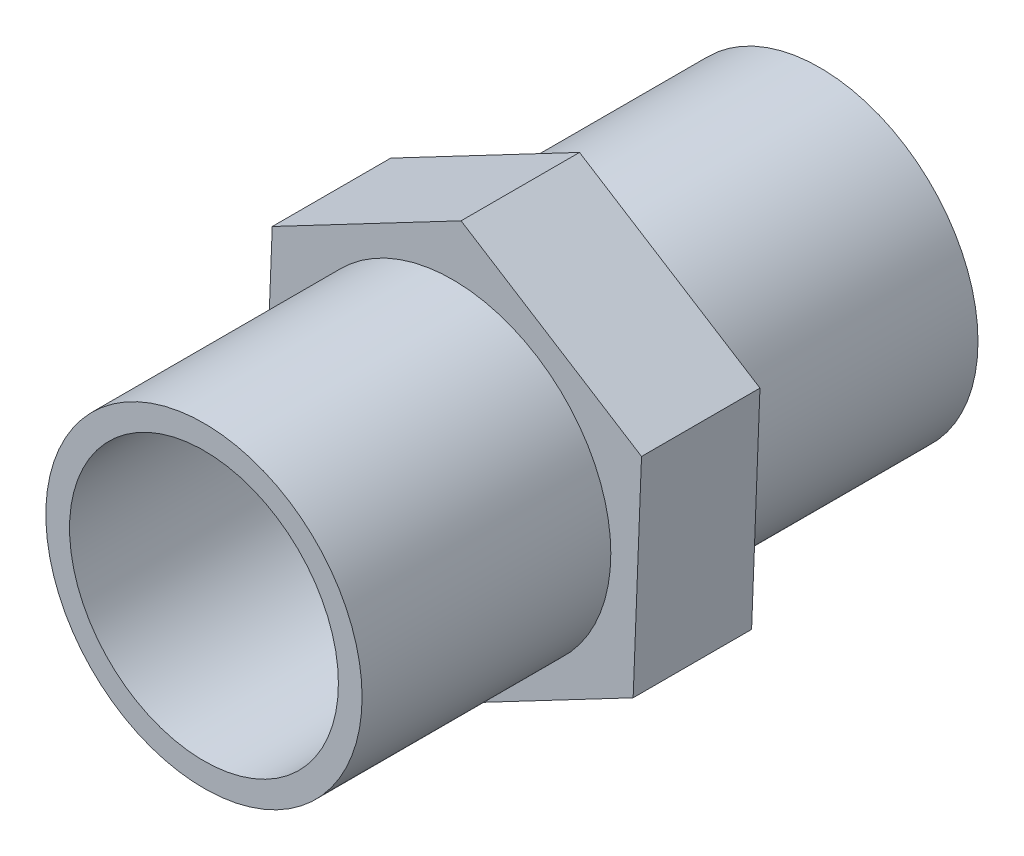
ISO-10303-21;
HEADER;
FILE_DESCRIPTION(('STEP AP214'),'2;1');
FILE_NAME('part.step','',(''),(''),'','','');
FILE_SCHEMA(('AUTOMOTIVE_DESIGN { 1 0 10303 214 1 1 1 1 }'));
ENDSEC;
DATA;
#1=APPLICATION_CONTEXT('core data for automotive mechanical design processes');
#2=APPLICATION_PROTOCOL_DEFINITION('international standard','automotive_design',2000,#1);
#3=PRODUCT_CONTEXT('',#1,'mechanical');
#4=PRODUCT('Part','Part','',(#3));
#5=PRODUCT_RELATED_PRODUCT_CATEGORY('part','',(#4));
#6=PRODUCT_DEFINITION_FORMATION('','',#4);
#7=PRODUCT_DEFINITION_CONTEXT('part definition',#1,'design');
#8=PRODUCT_DEFINITION('design','',#6,#7);
#9=PRODUCT_DEFINITION_SHAPE('','',#8);
#10=(LENGTH_UNIT() NAMED_UNIT(*) SI_UNIT(.MILLI.,.METRE.));
#11=(NAMED_UNIT(*) PLANE_ANGLE_UNIT() SI_UNIT($,.RADIAN.));
#12=(NAMED_UNIT(*) SI_UNIT($,.STERADIAN.) SOLID_ANGLE_UNIT());
#13=UNCERTAINTY_MEASURE_WITH_UNIT(LENGTH_MEASURE(1.E-05),#10,'distance_accuracy_value','');
#14=(GEOMETRIC_REPRESENTATION_CONTEXT(3) GLOBAL_UNCERTAINTY_ASSIGNED_CONTEXT((#13)) GLOBAL_UNIT_ASSIGNED_CONTEXT((#10,
#11,#12)) REPRESENTATION_CONTEXT('',''));
#15=CARTESIAN_POINT('',(0.,0.,0.));
#16=DIRECTION('',(0.,0.,1.));
#17=DIRECTION('',(1.,0.,0.));
#18=AXIS2_PLACEMENT_3D('',#15,#16,#17);
#19=CARTESIAN_POINT('',(-1.77635683940025E-12,-3.33066907387547E-13,26.0000000000002));
#20=DIRECTION('',(0.,0.,1.));
#21=DIRECTION('',(1.,0.,0.));
#22=AXIS2_PLACEMENT_3D('',#19,#20,#21);
#23=PLANE('',#22);
#24=CARTESIAN_POINT('',(-1.77635683940025E-12,-3.33066907387547E-13,26.0000000000002));
#25=DIRECTION('',(0.,0.,1.));
#26=DIRECTION('',(1.,0.,0.));
#27=AXIS2_PLACEMENT_3D('',#24,#25,#26);
#28=CIRCLE('',#27,13.35);
#29=CARTESIAN_POINT('',(13.3499999999982,-3.31387911903236E-13,26.0000000000002));
#30=VERTEX_POINT('',#29);
#31=EDGE_CURVE('E157',#30,#30,#28,.T.);
#32=ORIENTED_EDGE('',*,*,#31,.T.);
#33=EDGE_LOOP('',(#32));
#34=FACE_BOUND('',#33,.T.);
#35=CARTESIAN_POINT('',(-1.77635683940025E-12,-3.33066907387547E-13,26.0000000000002));
#36=DIRECTION('',(0.,0.,1.));
#37=DIRECTION('',(1.,0.,0.));
#38=AXIS2_PLACEMENT_3D('',#35,#36,#37);
#39=CIRCLE('',#38,11.35);
#40=CARTESIAN_POINT('',(11.3499999999982,-3.31639446807253E-13,26.0000000000002));
#41=VERTEX_POINT('',#40);
#42=EDGE_CURVE('E151',#41,#41,#39,.T.);
#43=ORIENTED_EDGE('',*,*,#42,.F.);
#44=EDGE_LOOP('',(#43));
#45=FACE_BOUND('',#44,.T.);
#46=ADVANCED_FACE('F40',(#34,#45),#23,.T.);
#47=CARTESIAN_POINT('',(-1.77635683940025E-12,-3.33066907387547E-13,26.0000000000002));
#48=DIRECTION('',(0.,0.,-1.));
#49=DIRECTION('',(-1.,0.,0.));
#50=AXIS2_PLACEMENT_3D('',#47,#48,#49);
#51=CYLINDRICAL_SURFACE('',#50,13.35);
#52=CARTESIAN_POINT('',(1.77635683940025E-12,1.11022302462516E-13,5.00000000000034));
#53=DIRECTION('',(0.,0.,1.));
#54=DIRECTION('',(1.,0.,0.));
#55=AXIS2_PLACEMENT_3D('',#52,#53,#54);
#56=CIRCLE('',#55,13.35);
#57=CARTESIAN_POINT('',(13.3500000000018,1.12701297946827E-13,5.00000000000034));
#58=VERTEX_POINT('',#57);
#59=EDGE_CURVE('E147',#58,#58,#56,.T.);
#60=ORIENTED_EDGE('',*,*,#59,.T.);
#61=EDGE_LOOP('',(#60));
#62=FACE_BOUND('',#61,.T.);
#63=ORIENTED_EDGE('',*,*,#31,.F.);
#64=EDGE_LOOP('',(#63));
#65=FACE_BOUND('',#64,.T.);
#66=ADVANCED_FACE('F42',(#62,#65),#51,.T.);
#67=CARTESIAN_POINT('',(-1.77635683940025E-12,-3.33066907387547E-13,26.0000000000002));
#68=DIRECTION('',(0.,0.,-1.));
#69=DIRECTION('',(-1.,0.,0.));
#70=AXIS2_PLACEMENT_3D('',#67,#68,#69);
#71=CYLINDRICAL_SURFACE('',#70,11.35);
#72=CARTESIAN_POINT('',(1.77635683940025E-12,1.11022302462516E-13,5.00000000000034));
#73=DIRECTION('',(0.,0.,1.));
#74=DIRECTION('',(1.,0.,0.));
#75=AXIS2_PLACEMENT_3D('',#72,#73,#74);
#76=CIRCLE('',#75,11.35);
#77=CARTESIAN_POINT('',(11.3500000000018,1.1244976304281E-13,5.00000000000034));
#78=VERTEX_POINT('',#77);
#79=EDGE_CURVE('E44',#78,#78,#76,.T.);
#80=ORIENTED_EDGE('',*,*,#79,.F.);
#81=EDGE_LOOP('',(#80));
#82=FACE_BOUND('',#81,.T.);
#83=ORIENTED_EDGE('',*,*,#42,.T.);
#84=EDGE_LOOP('',(#83));
#85=FACE_BOUND('',#84,.T.);
#86=ADVANCED_FACE('F176',(#82,#85),#71,.F.);
#87=CARTESIAN_POINT('',(1.77635683940025E-12,1.11022302462516E-13,5.00000000000034));
#88=DIRECTION('',(0.,0.,1.));
#89=DIRECTION('',(1.,0.,0.));
#90=AXIS2_PLACEMENT_3D('',#87,#88,#89);
#91=PLANE('',#90);
#92=ORIENTED_EDGE('',*,*,#79,.T.);
#93=EDGE_LOOP('',(#92));
#94=FACE_BOUND('',#93,.T.);
#95=ADVANCED_FACE('F216',(#94),#91,.T.);
#96=CARTESIAN_POINT('',(15.2347430276922,-9.61265103578213,4.99999999999989));
#97=DIRECTION('',(-0.99922858635306,0.0392712644928826,0.));
#98=DIRECTION('',(-0.0392712644928829,-0.999228586353058,0.));
#99=AXIS2_PLACEMENT_3D('',#96,#97,#98);
#100=PLANE('',#99);
#101=DIRECTION('',(0.0392712644928829,0.999228586353058,0.));
#102=VECTOR('',#101,1.);
#103=CARTESIAN_POINT('',(15.2347430276896,-9.61265103578191,-5.00000000000034));
#104=LINE('',#103,#102);
#105=CARTESIAN_POINT('',(15.2347430276896,-9.61265103578191,-5.00000000000034));
#106=VERTEX_POINT('',#105);
#107=CARTESIAN_POINT('',(15.9421715085468,8.38734896421744,-5.00000000000012));
#108=VERTEX_POINT('',#107);
#109=EDGE_CURVE('E127',#106,#108,#104,.T.);
#110=ORIENTED_EDGE('',*,*,#109,.T.);
#111=DIRECTION('',(0.,0.,-1.));
#112=VECTOR('',#111,1.);
#113=CARTESIAN_POINT('',(15.9421715085459,8.38734896421744,4.99999999999967));
#114=LINE('',#113,#112);
#115=CARTESIAN_POINT('',(15.9421715085459,8.38734896421744,4.99999999999967));
#116=VERTEX_POINT('',#115);
#117=EDGE_CURVE('E144',#116,#108,#114,.T.);
#118=ORIENTED_EDGE('',*,*,#117,.F.);
#119=DIRECTION('',(0.0392712644928829,0.999228586353058,0.));
#120=VECTOR('',#119,1.);
#121=CARTESIAN_POINT('',(15.2347430276922,-9.61265103578213,4.99999999999989));
#122=LINE('',#121,#120);
#123=CARTESIAN_POINT('',(15.2347430276922,-9.61265103578213,4.99999999999989));
#124=VERTEX_POINT('',#123);
#125=EDGE_CURVE('E137',#124,#116,#122,.T.);
#126=ORIENTED_EDGE('',*,*,#125,.F.);
#127=DIRECTION('',(0.,0.,-1.));
#128=VECTOR('',#127,1.);
#129=CARTESIAN_POINT('',(15.2347430276922,-9.61265103578213,4.99999999999989));
#130=LINE('',#129,#128);
#131=EDGE_CURVE('E123',#124,#106,#130,.T.);
#132=ORIENTED_EDGE('',*,*,#131,.T.);
#133=EDGE_LOOP('',(#110,#118,#126,#132));
#134=FACE_BOUND('',#133,.T.);
#135=ADVANCED_FACE('F207',(#134),#100,.F.);
#136=CARTESIAN_POINT('',(15.9421715085459,8.38734896421744,4.99999999999967));
#137=DIRECTION('',(-0.533624205866104,-0.84572170772292,0.));
#138=DIRECTION('',(0.845721707722921,-0.533624205866103,0.));
#139=AXIS2_PLACEMENT_3D('',#136,#137,#138);
#140=PLANE('',#139);
#141=DIRECTION('',(-0.845721707722921,0.533624205866103,0.));
#142=VECTOR('',#141,1.);
#143=CARTESIAN_POINT('',(15.9421715085468,8.38734896421744,-5.00000000000012));
#144=LINE('',#143,#142);
#145=CARTESIAN_POINT('',(0.707428480855476,17.9999999999997,-5.00000000000034));
#146=VERTEX_POINT('',#145);
#147=EDGE_CURVE('E130',#108,#146,#144,.T.);
#148=ORIENTED_EDGE('',*,*,#147,.T.);
#149=DIRECTION('',(0.,0.,-1.));
#150=VECTOR('',#149,1.);
#151=CARTESIAN_POINT('',(0.707428480854588,17.9999999999998,4.99999999999989));
#152=LINE('',#151,#150);
#153=CARTESIAN_POINT('',(0.707428480854588,17.9999999999998,4.99999999999989));
#154=VERTEX_POINT('',#153);
#155=EDGE_CURVE('E141',#154,#146,#152,.T.);
#156=ORIENTED_EDGE('',*,*,#155,.F.);
#157=DIRECTION('',(-0.845721707722921,0.533624205866103,0.));
#158=VECTOR('',#157,1.);
#159=CARTESIAN_POINT('',(15.9421715085459,8.38734896421744,4.99999999999967));
#160=LINE('',#159,#158);
#161=EDGE_CURVE('E96',#116,#154,#160,.T.);
#162=ORIENTED_EDGE('',*,*,#161,.F.);
#163=ORIENTED_EDGE('',*,*,#117,.T.);
#164=EDGE_LOOP('',(#148,#156,#162,#163));
#165=FACE_BOUND('',#164,.T.);
#166=ADVANCED_FACE('F224',(#165),#140,.F.);
#167=CARTESIAN_POINT('',(0.707428480854588,17.9999999999998,4.99999999999989));
#168=DIRECTION('',(0.465604380486956,-0.884992972215803,0.));
#169=DIRECTION('',(0.884992972215804,0.465604380486955,0.));
#170=AXIS2_PLACEMENT_3D('',#167,#168,#169);
#171=PLANE('',#170);
#172=DIRECTION('',(-0.884992972215804,-0.465604380486955,0.));
#173=VECTOR('',#172,1.);
#174=CARTESIAN_POINT('',(0.707428480855476,17.9999999999997,-5.00000000000034));
#175=LINE('',#174,#173);
#176=CARTESIAN_POINT('',(-15.234743027694,9.61265103578224,-4.99999999999989));
#177=VERTEX_POINT('',#176);
#178=EDGE_CURVE('E132',#146,#177,#175,.T.);
#179=ORIENTED_EDGE('',*,*,#178,.T.);
#180=DIRECTION('',(0.,0.,-1.));
#181=VECTOR('',#180,1.);
#182=CARTESIAN_POINT('',(-15.2347430276905,9.61265103578179,5.00000000000034));
#183=LINE('',#182,#181);
#184=CARTESIAN_POINT('',(-15.2347430276905,9.61265103578179,5.00000000000034));
#185=VERTEX_POINT('',#184);
#186=EDGE_CURVE('E118',#185,#177,#183,.T.);
#187=ORIENTED_EDGE('',*,*,#186,.F.);
#188=DIRECTION('',(-0.884992972215804,-0.465604380486955,0.));
#189=VECTOR('',#188,1.);
#190=CARTESIAN_POINT('',(0.707428480854588,17.9999999999998,4.99999999999989));
#191=LINE('',#190,#189);
#192=EDGE_CURVE('E109',#154,#185,#191,.T.);
#193=ORIENTED_EDGE('',*,*,#192,.F.);
#194=ORIENTED_EDGE('',*,*,#155,.T.);
#195=EDGE_LOOP('',(#179,#187,#193,#194));
#196=FACE_BOUND('',#195,.T.);
#197=ADVANCED_FACE('F221',(#196),#171,.F.);
#198=CARTESIAN_POINT('',(-15.2347430276905,9.61265103578179,5.00000000000034));
#199=DIRECTION('',(0.99922858635306,-0.0392712644928828,0.));
#200=DIRECTION('',(0.039271264492883,0.999228586353058,0.));
#201=AXIS2_PLACEMENT_3D('',#198,#199,#200);
#202=PLANE('',#201);
#203=DIRECTION('',(-0.0392712644928829,-0.999228586353058,0.));
#204=VECTOR('',#203,1.);
#205=CARTESIAN_POINT('',(-15.234743027694,9.61265103578224,-4.99999999999989));
#206=LINE('',#205,#204);
#207=CARTESIAN_POINT('',(-15.9421715085495,-8.38734896421789,-5.00000000000034));
#208=VERTEX_POINT('',#207);
#209=EDGE_CURVE('E117',#177,#208,#206,.T.);
#210=ORIENTED_EDGE('',*,*,#209,.T.);
#211=DIRECTION('',(0.,0.,-1.));
#212=VECTOR('',#211,1.);
#213=CARTESIAN_POINT('',(-15.9421715085486,-8.38734896421811,4.99999999999989));
#214=LINE('',#213,#212);
#215=CARTESIAN_POINT('',(-15.9421715085486,-8.38734896421811,4.99999999999989));
#216=VERTEX_POINT('',#215);
#217=EDGE_CURVE('E114',#216,#208,#214,.T.);
#218=ORIENTED_EDGE('',*,*,#217,.F.);
#219=DIRECTION('',(-0.0392712644928829,-0.999228586353058,0.));
#220=VECTOR('',#219,1.);
#221=CARTESIAN_POINT('',(-15.2347430276905,9.61265103578179,5.00000000000034));
#222=LINE('',#221,#220);
#223=EDGE_CURVE('E103',#185,#216,#222,.T.);
#224=ORIENTED_EDGE('',*,*,#223,.F.);
#225=ORIENTED_EDGE('',*,*,#186,.T.);
#226=EDGE_LOOP('',(#210,#218,#224,#225));
#227=FACE_BOUND('',#226,.T.);
#228=ADVANCED_FACE('F115',(#227),#202,.F.);
#229=CARTESIAN_POINT('',(-15.9421715085486,-8.38734896421811,4.99999999999989));
#230=DIRECTION('',(0.533624205866104,0.84572170772292,0.));
#231=DIRECTION('',(-0.845721707722921,0.533624205866103,0.));
#232=AXIS2_PLACEMENT_3D('',#229,#230,#231);
#233=PLANE('',#232);
#234=DIRECTION('',(0.845721707722921,-0.533624205866103,0.));
#235=VECTOR('',#234,1.);
#236=CARTESIAN_POINT('',(-15.9421715085495,-8.38734896421789,-5.00000000000034));
#237=LINE('',#236,#235);
#238=CARTESIAN_POINT('',(-0.7074284808537,-18.0000000000003,-4.99999999999989));
#239=VERTEX_POINT('',#238);
#240=EDGE_CURVE('E81',#208,#239,#237,.T.);
#241=ORIENTED_EDGE('',*,*,#240,.T.);
#242=DIRECTION('',(0.,0.,-1.));
#243=VECTOR('',#242,1.);
#244=CARTESIAN_POINT('',(-0.707428480855476,-18.0000000000002,5.00000000000012));
#245=LINE('',#244,#243);
#246=CARTESIAN_POINT('',(-0.707428480855476,-18.0000000000002,5.00000000000012));
#247=VERTEX_POINT('',#246);
#248=EDGE_CURVE('E119',#247,#239,#245,.T.);
#249=ORIENTED_EDGE('',*,*,#248,.F.);
#250=DIRECTION('',(0.845721707722921,-0.533624205866103,0.));
#251=VECTOR('',#250,1.);
#252=CARTESIAN_POINT('',(-15.9421715085486,-8.38734896421811,4.99999999999989));
#253=LINE('',#252,#251);
#254=EDGE_CURVE('E107',#216,#247,#253,.T.);
#255=ORIENTED_EDGE('',*,*,#254,.F.);
#256=ORIENTED_EDGE('',*,*,#217,.T.);
#257=EDGE_LOOP('',(#241,#249,#255,#256));
#258=FACE_BOUND('',#257,.T.);
#259=ADVANCED_FACE('F121',(#258),#233,.F.);
#260=CARTESIAN_POINT('',(-0.707428480855476,-18.0000000000002,5.00000000000012));
#261=DIRECTION('',(-0.465604380486956,0.884992972215802,0.));
#262=DIRECTION('',(-0.884992972215804,-0.465604380486955,0.));
#263=AXIS2_PLACEMENT_3D('',#260,#261,#262);
#264=PLANE('',#263);
#265=DIRECTION('',(0.884992972215804,0.465604380486955,0.));
#266=VECTOR('',#265,1.);
#267=CARTESIAN_POINT('',(-0.7074284808537,-18.0000000000003,-4.99999999999989));
#268=LINE('',#267,#266);
#269=EDGE_CURVE('E87',#239,#106,#268,.T.);
#270=ORIENTED_EDGE('',*,*,#269,.T.);
#271=ORIENTED_EDGE('',*,*,#131,.F.);
#272=DIRECTION('',(0.884992972215804,0.465604380486955,0.));
#273=VECTOR('',#272,1.);
#274=CARTESIAN_POINT('',(-0.707428480855476,-18.0000000000002,5.00000000000012));
#275=LINE('',#274,#273);
#276=EDGE_CURVE('E58',#247,#124,#275,.T.);
#277=ORIENTED_EDGE('',*,*,#276,.F.);
#278=ORIENTED_EDGE('',*,*,#248,.T.);
#279=EDGE_LOOP('',(#270,#271,#277,#278));
#280=FACE_BOUND('',#279,.T.);
#281=ADVANCED_FACE('F209',(#280),#264,.F.);
#282=ORIENTED_EDGE('',*,*,#59,.F.);
#283=EDGE_LOOP('',(#282));
#284=FACE_BOUND('',#283,.T.);
#285=ORIENTED_EDGE('',*,*,#125,.T.);
#286=ORIENTED_EDGE('',*,*,#161,.T.);
#287=ORIENTED_EDGE('',*,*,#192,.T.);
#288=ORIENTED_EDGE('',*,*,#223,.T.);
#289=ORIENTED_EDGE('',*,*,#254,.T.);
#290=ORIENTED_EDGE('',*,*,#276,.T.);
#291=EDGE_LOOP('',(#285,#286,#287,#288,#289,#290));
#292=FACE_BOUND('',#291,.T.);
#293=ADVANCED_FACE('F105',(#284,#292),#91,.T.);
#294=CARTESIAN_POINT('',(-2.66453525910038E-12,-4.44089209850063E-13,-5.00000000000012));
#295=DIRECTION('',(0.,0.,1.));
#296=DIRECTION('',(1.,0.,0.));
#297=AXIS2_PLACEMENT_3D('',#294,#295,#296);
#298=PLANE('',#297);
#299=CARTESIAN_POINT('',(-2.66453525910038E-12,-4.44089209850063E-13,-5.00000000000012));
#300=DIRECTION('',(0.,0.,1.));
#301=DIRECTION('',(1.,0.,0.));
#302=AXIS2_PLACEMENT_3D('',#299,#300,#301);
#303=CIRCLE('',#302,13.35);
#304=CARTESIAN_POINT('',(13.3499999999974,-4.42410214365752E-13,-5.00000000000012));
#305=VERTEX_POINT('',#304);
#306=EDGE_CURVE('E12',#305,#305,#303,.T.);
#307=ORIENTED_EDGE('',*,*,#306,.T.);
#308=EDGE_LOOP('',(#307));
#309=FACE_BOUND('',#308,.T.);
#310=ORIENTED_EDGE('',*,*,#109,.F.);
#311=ORIENTED_EDGE('',*,*,#269,.F.);
#312=ORIENTED_EDGE('',*,*,#240,.F.);
#313=ORIENTED_EDGE('',*,*,#209,.F.);
#314=ORIENTED_EDGE('',*,*,#178,.F.);
#315=ORIENTED_EDGE('',*,*,#147,.F.);
#316=EDGE_LOOP('',(#310,#311,#312,#313,#314,#315));
#317=FACE_BOUND('',#316,.T.);
#318=ADVANCED_FACE('F169',(#309,#317),#298,.F.);
#319=CARTESIAN_POINT('',(-1.77635683940025E-12,1.11022302462516E-13,-26.));
#320=DIRECTION('',(0.,0.,1.));
#321=DIRECTION('',(1.,0.,0.));
#322=AXIS2_PLACEMENT_3D('',#319,#320,#321);
#323=CIRCLE('',#322,13.35);
#324=CARTESIAN_POINT('',(13.3499999999982,1.12701297946827E-13,-26.));
#325=VERTEX_POINT('',#324);
#326=EDGE_CURVE('E154',#325,#325,#323,.T.);
#327=ORIENTED_EDGE('',*,*,#326,.T.);
#328=EDGE_LOOP('',(#327));
#329=FACE_BOUND('',#328,.T.);
#330=ORIENTED_EDGE('',*,*,#306,.F.);
#331=EDGE_LOOP('',(#330));
#332=FACE_BOUND('',#331,.T.);
#333=ADVANCED_FACE('F180',(#329,#332),#51,.T.);
#334=CARTESIAN_POINT('',(-1.77635683940025E-12,1.11022302462516E-13,-26.));
#335=DIRECTION('',(0.,0.,1.));
#336=DIRECTION('',(1.,0.,0.));
#337=AXIS2_PLACEMENT_3D('',#334,#335,#336);
#338=PLANE('',#337);
#339=ORIENTED_EDGE('',*,*,#326,.F.);
#340=EDGE_LOOP('',(#339));
#341=FACE_BOUND('',#340,.T.);
#342=CARTESIAN_POINT('',(-1.77635683940025E-12,1.11022302462516E-13,-26.));
#343=DIRECTION('',(0.,0.,1.));
#344=DIRECTION('',(1.,0.,0.));
#345=AXIS2_PLACEMENT_3D('',#342,#343,#344);
#346=CIRCLE('',#345,11.35);
#347=CARTESIAN_POINT('',(11.3499999999982,1.1244976304281E-13,-26.));
#348=VERTEX_POINT('',#347);
#349=EDGE_CURVE('E150',#348,#348,#346,.T.);
#350=ORIENTED_EDGE('',*,*,#349,.T.);
#351=EDGE_LOOP('',(#350));
#352=FACE_BOUND('',#351,.T.);
#353=ADVANCED_FACE('F173',(#341,#352),#338,.F.);
#354=ORIENTED_EDGE('',*,*,#349,.F.);
#355=EDGE_LOOP('',(#354));
#356=FACE_BOUND('',#355,.T.);
#357=CARTESIAN_POINT('',(-2.66453525910038E-12,-4.44089209850063E-13,-5.00000000000012));
#358=DIRECTION('',(0.,0.,1.));
#359=DIRECTION('',(1.,0.,0.));
#360=AXIS2_PLACEMENT_3D('',#357,#358,#359);
#361=CIRCLE('',#360,11.35);
#362=CARTESIAN_POINT('',(11.3499999999974,-4.42661749269768E-13,-5.00000000000012));
#363=VERTEX_POINT('',#362);
#364=EDGE_CURVE('E145',#363,#363,#361,.T.);
#365=ORIENTED_EDGE('',*,*,#364,.T.);
#366=EDGE_LOOP('',(#365));
#367=FACE_BOUND('',#366,.T.);
#368=ADVANCED_FACE('F164',(#356,#367),#71,.F.);
#369=ORIENTED_EDGE('',*,*,#364,.F.);
#370=EDGE_LOOP('',(#369));
#371=FACE_BOUND('',#370,.T.);
#372=ADVANCED_FACE('F166',(#371),#298,.F.);
#373=CLOSED_SHELL('',(#46,#66,#86,#95,#135,#166,#197,#228,#259,#281,#293,#318,#333,#353,#368,#372));
#374=MANIFOLD_SOLID_BREP('B2',#373);
#375=ADVANCED_BREP_SHAPE_REPRESENTATION('',(#18,#374),#14);
#376=SHAPE_DEFINITION_REPRESENTATION(#9,#375);
ENDSEC;
END-ISO-10303-21;
